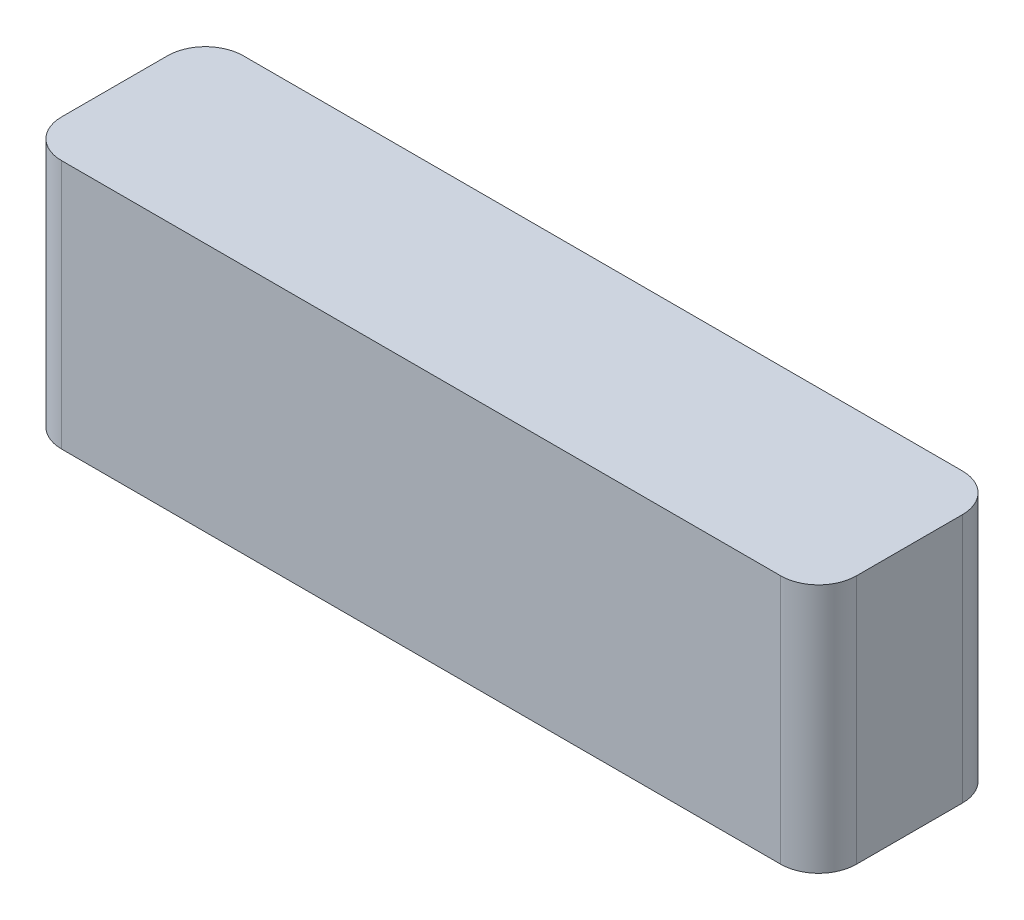
ISO-10303-21;
HEADER;
FILE_DESCRIPTION(('STEP AP214'),'2;1');
FILE_NAME('part.step','',(''),(''),'','','');
FILE_SCHEMA(('AUTOMOTIVE_DESIGN { 1 0 10303 214 1 1 1 1 }'));
ENDSEC;
DATA;
#1=APPLICATION_CONTEXT('core data for automotive mechanical design processes');
#2=APPLICATION_PROTOCOL_DEFINITION('international standard','automotive_design',2000,#1);
#3=PRODUCT_CONTEXT('',#1,'mechanical');
#4=PRODUCT('Part','Part','',(#3));
#5=PRODUCT_RELATED_PRODUCT_CATEGORY('part','',(#4));
#6=PRODUCT_DEFINITION_FORMATION('','',#4);
#7=PRODUCT_DEFINITION_CONTEXT('part definition',#1,'design');
#8=PRODUCT_DEFINITION('design','',#6,#7);
#9=PRODUCT_DEFINITION_SHAPE('','',#8);
#10=(LENGTH_UNIT() NAMED_UNIT(*) SI_UNIT(.MILLI.,.METRE.));
#11=(NAMED_UNIT(*) PLANE_ANGLE_UNIT() SI_UNIT($,.RADIAN.));
#12=(NAMED_UNIT(*) SI_UNIT($,.STERADIAN.) SOLID_ANGLE_UNIT());
#13=UNCERTAINTY_MEASURE_WITH_UNIT(LENGTH_MEASURE(1.E-05),#10,'distance_accuracy_value','');
#14=(GEOMETRIC_REPRESENTATION_CONTEXT(3) GLOBAL_UNCERTAINTY_ASSIGNED_CONTEXT((#13)) GLOBAL_UNIT_ASSIGNED_CONTEXT((#10,
#11,#12)) REPRESENTATION_CONTEXT('',''));
#15=CARTESIAN_POINT('',(0.,0.,0.));
#16=DIRECTION('',(0.,0.,1.));
#17=DIRECTION('',(1.,0.,0.));
#18=AXIS2_PLACEMENT_3D('',#15,#16,#17);
#19=CARTESIAN_POINT('',(52.5,33.,12.));
#20=DIRECTION('',(-1.,0.,0.));
#21=DIRECTION('',(0.,0.,1.));
#22=AXIS2_PLACEMENT_3D('',#19,#20,#21);
#23=PLANE('',#22);
#24=DIRECTION('',(0.,0.,-1.));
#25=VECTOR('',#24,1.);
#26=CARTESIAN_POINT('',(52.5,0.,12.));
#27=LINE('',#26,#25);
#28=CARTESIAN_POINT('',(52.5,0.,7.));
#29=VERTEX_POINT('',#28);
#30=CARTESIAN_POINT('',(52.5,0.,-7.));
#31=VERTEX_POINT('',#30);
#32=EDGE_CURVE('E156',#29,#31,#27,.T.);
#33=ORIENTED_EDGE('',*,*,#32,.T.);
#34=DIRECTION('',(0.,-1.,0.));
#35=VECTOR('',#34,1.);
#36=CARTESIAN_POINT('',(52.5,33.,-7.));
#37=LINE('',#36,#35);
#38=CARTESIAN_POINT('',(52.5,33.,-7.));
#39=VERTEX_POINT('',#38);
#40=EDGE_CURVE('E11',#31,#39,#37,.F.);
#41=ORIENTED_EDGE('',*,*,#40,.T.);
#42=DIRECTION('',(0.,0.,-1.));
#43=VECTOR('',#42,1.);
#44=CARTESIAN_POINT('',(52.5,33.,12.));
#45=LINE('',#44,#43);
#46=CARTESIAN_POINT('',(52.5,33.,7.));
#47=VERTEX_POINT('',#46);
#48=EDGE_CURVE('E124',#47,#39,#45,.T.);
#49=ORIENTED_EDGE('',*,*,#48,.F.);
#50=DIRECTION('',(0.,-1.,0.));
#51=VECTOR('',#50,1.);
#52=CARTESIAN_POINT('',(52.5,33.,7.));
#53=LINE('',#52,#51);
#54=EDGE_CURVE('E40',#47,#29,#53,.T.);
#55=ORIENTED_EDGE('',*,*,#54,.T.);
#56=EDGE_LOOP('',(#33,#41,#49,#55));
#57=FACE_BOUND('',#56,.T.);
#58=ADVANCED_FACE('F32',(#57),#23,.F.);
#59=CARTESIAN_POINT('',(-52.5,33.,-12.));
#60=DIRECTION('',(0.,0.,1.));
#61=DIRECTION('',(1.,0.,0.));
#62=AXIS2_PLACEMENT_3D('',#59,#60,#61);
#63=PLANE('',#62);
#64=DIRECTION('',(-1.,0.,0.));
#65=VECTOR('',#64,1.);
#66=CARTESIAN_POINT('',(-52.5,0.,-12.));
#67=LINE('',#66,#65);
#68=CARTESIAN_POINT('',(47.5,0.,-12.));
#69=VERTEX_POINT('',#68);
#70=CARTESIAN_POINT('',(-47.5,0.,-12.));
#71=VERTEX_POINT('',#70);
#72=EDGE_CURVE('E129',#69,#71,#67,.T.);
#73=ORIENTED_EDGE('',*,*,#72,.T.);
#74=DIRECTION('',(0.,-1.,0.));
#75=VECTOR('',#74,1.);
#76=CARTESIAN_POINT('',(-47.5,33.,-12.));
#77=LINE('',#76,#75);
#78=CARTESIAN_POINT('',(-47.5,33.,-12.));
#79=VERTEX_POINT('',#78);
#80=EDGE_CURVE('E47',#71,#79,#77,.F.);
#81=ORIENTED_EDGE('',*,*,#80,.T.);
#82=DIRECTION('',(-1.,0.,0.));
#83=VECTOR('',#82,1.);
#84=CARTESIAN_POINT('',(-52.5,33.,-12.));
#85=LINE('',#84,#83);
#86=CARTESIAN_POINT('',(47.5,33.,-12.));
#87=VERTEX_POINT('',#86);
#88=EDGE_CURVE('E127',#87,#79,#85,.T.);
#89=ORIENTED_EDGE('',*,*,#88,.F.);
#90=DIRECTION('',(0.,-1.,0.));
#91=VECTOR('',#90,1.);
#92=CARTESIAN_POINT('',(47.5,33.,-12.));
#93=LINE('',#92,#91);
#94=EDGE_CURVE('E148',#87,#69,#93,.T.);
#95=ORIENTED_EDGE('',*,*,#94,.T.);
#96=EDGE_LOOP('',(#73,#81,#89,#95));
#97=FACE_BOUND('',#96,.T.);
#98=ADVANCED_FACE('F176',(#97),#63,.F.);
#99=CARTESIAN_POINT('',(-52.5,33.,12.));
#100=DIRECTION('',(1.,0.,0.));
#101=DIRECTION('',(0.,0.,-1.));
#102=AXIS2_PLACEMENT_3D('',#99,#100,#101);
#103=PLANE('',#102);
#104=DIRECTION('',(0.,0.,1.));
#105=VECTOR('',#104,1.);
#106=CARTESIAN_POINT('',(-52.5,0.,12.));
#107=LINE('',#106,#105);
#108=CARTESIAN_POINT('',(-52.5,0.,-7.));
#109=VERTEX_POINT('',#108);
#110=CARTESIAN_POINT('',(-52.5,0.,7.));
#111=VERTEX_POINT('',#110);
#112=EDGE_CURVE('E125',#109,#111,#107,.T.);
#113=ORIENTED_EDGE('',*,*,#112,.T.);
#114=DIRECTION('',(0.,-1.,0.));
#115=VECTOR('',#114,1.);
#116=CARTESIAN_POINT('',(-52.5,33.,7.));
#117=LINE('',#116,#115);
#118=CARTESIAN_POINT('',(-52.5,33.,7.));
#119=VERTEX_POINT('',#118);
#120=EDGE_CURVE('E103',#111,#119,#117,.F.);
#121=ORIENTED_EDGE('',*,*,#120,.T.);
#122=DIRECTION('',(0.,0.,1.));
#123=VECTOR('',#122,1.);
#124=CARTESIAN_POINT('',(-52.5,33.,12.));
#125=LINE('',#124,#123);
#126=CARTESIAN_POINT('',(-52.5,33.,-7.));
#127=VERTEX_POINT('',#126);
#128=EDGE_CURVE('E164',#127,#119,#125,.T.);
#129=ORIENTED_EDGE('',*,*,#128,.F.);
#130=DIRECTION('',(0.,-1.,0.));
#131=VECTOR('',#130,1.);
#132=CARTESIAN_POINT('',(-52.5,33.,-7.));
#133=LINE('',#132,#131);
#134=EDGE_CURVE('E108',#127,#109,#133,.T.);
#135=ORIENTED_EDGE('',*,*,#134,.T.);
#136=EDGE_LOOP('',(#113,#121,#129,#135));
#137=FACE_BOUND('',#136,.T.);
#138=ADVANCED_FACE('F175',(#137),#103,.F.);
#139=CARTESIAN_POINT('',(-52.5,33.,12.));
#140=DIRECTION('',(0.,0.,-1.));
#141=DIRECTION('',(-1.,0.,0.));
#142=AXIS2_PLACEMENT_3D('',#139,#140,#141);
#143=PLANE('',#142);
#144=DIRECTION('',(1.,0.,0.));
#145=VECTOR('',#144,1.);
#146=CARTESIAN_POINT('',(-52.5,33.,12.));
#147=LINE('',#146,#145);
#148=CARTESIAN_POINT('',(-47.5,33.,12.));
#149=VERTEX_POINT('',#148);
#150=CARTESIAN_POINT('',(47.5,33.,12.));
#151=VERTEX_POINT('',#150);
#152=EDGE_CURVE('E118',#149,#151,#147,.T.);
#153=ORIENTED_EDGE('',*,*,#152,.F.);
#154=DIRECTION('',(0.,-1.,0.));
#155=VECTOR('',#154,1.);
#156=CARTESIAN_POINT('',(-47.5,33.,12.));
#157=LINE('',#156,#155);
#158=CARTESIAN_POINT('',(-47.5,0.,12.));
#159=VERTEX_POINT('',#158);
#160=EDGE_CURVE('E102',#149,#159,#157,.T.);
#161=ORIENTED_EDGE('',*,*,#160,.T.);
#162=DIRECTION('',(1.,0.,0.));
#163=VECTOR('',#162,1.);
#164=CARTESIAN_POINT('',(-52.5,0.,12.));
#165=LINE('',#164,#163);
#166=CARTESIAN_POINT('',(47.5,0.,12.));
#167=VERTEX_POINT('',#166);
#168=EDGE_CURVE('E115',#159,#167,#165,.T.);
#169=ORIENTED_EDGE('',*,*,#168,.T.);
#170=DIRECTION('',(0.,-1.,0.));
#171=VECTOR('',#170,1.);
#172=CARTESIAN_POINT('',(47.5,33.,12.));
#173=LINE('',#172,#171);
#174=EDGE_CURVE('E120',#167,#151,#173,.F.);
#175=ORIENTED_EDGE('',*,*,#174,.T.);
#176=EDGE_LOOP('',(#153,#161,#169,#175));
#177=FACE_BOUND('',#176,.T.);
#178=ADVANCED_FACE('F114',(#177),#143,.F.);
#179=CARTESIAN_POINT('',(0.,33.,0.));
#180=DIRECTION('',(0.,-1.,0.));
#181=DIRECTION('',(0.,0.,-1.));
#182=AXIS2_PLACEMENT_3D('',#179,#180,#181);
#183=PLANE('',#182);
#184=ORIENTED_EDGE('',*,*,#128,.T.);
#185=CARTESIAN_POINT('',(-47.5,33.,7.));
#186=DIRECTION('',(0.,-1.,0.));
#187=DIRECTION('',(0.,0.,-1.));
#188=AXIS2_PLACEMENT_3D('',#185,#186,#187);
#189=CIRCLE('',#188,5.);
#190=EDGE_CURVE('E146',#119,#149,#189,.F.);
#191=ORIENTED_EDGE('',*,*,#190,.T.);
#192=ORIENTED_EDGE('',*,*,#152,.T.);
#193=CARTESIAN_POINT('',(47.5,33.,7.));
#194=DIRECTION('',(0.,-1.,0.));
#195=DIRECTION('',(0.,0.,-1.));
#196=AXIS2_PLACEMENT_3D('',#193,#194,#195);
#197=CIRCLE('',#196,5.);
#198=EDGE_CURVE('E141',#151,#47,#197,.F.);
#199=ORIENTED_EDGE('',*,*,#198,.T.);
#200=ORIENTED_EDGE('',*,*,#48,.T.);
#201=CARTESIAN_POINT('',(47.5,33.,-7.));
#202=DIRECTION('',(0.,-1.,0.));
#203=DIRECTION('',(0.,0.,-1.));
#204=AXIS2_PLACEMENT_3D('',#201,#202,#203);
#205=CIRCLE('',#204,5.);
#206=EDGE_CURVE('E54',#39,#87,#205,.F.);
#207=ORIENTED_EDGE('',*,*,#206,.T.);
#208=ORIENTED_EDGE('',*,*,#88,.T.);
#209=CARTESIAN_POINT('',(-47.5,33.,-7.));
#210=DIRECTION('',(0.,-1.,0.));
#211=DIRECTION('',(0.,0.,-1.));
#212=AXIS2_PLACEMENT_3D('',#209,#210,#211);
#213=CIRCLE('',#212,5.);
#214=EDGE_CURVE('E144',#79,#127,#213,.F.);
#215=ORIENTED_EDGE('',*,*,#214,.T.);
#216=EDGE_LOOP('',(#184,#191,#192,#199,#200,#207,#208,#215));
#217=FACE_BOUND('',#216,.T.);
#218=ADVANCED_FACE('F168',(#217),#183,.F.);
#219=CARTESIAN_POINT('',(0.,0.,0.));
#220=DIRECTION('',(0.,-1.,0.));
#221=DIRECTION('',(0.,0.,-1.));
#222=AXIS2_PLACEMENT_3D('',#219,#220,#221);
#223=PLANE('',#222);
#224=ORIENTED_EDGE('',*,*,#168,.F.);
#225=CARTESIAN_POINT('',(-47.5,0.,7.));
#226=DIRECTION('',(0.,-1.,0.));
#227=DIRECTION('',(0.,0.,-1.));
#228=AXIS2_PLACEMENT_3D('',#225,#226,#227);
#229=CIRCLE('',#228,5.);
#230=EDGE_CURVE('E98',#159,#111,#229,.T.);
#231=ORIENTED_EDGE('',*,*,#230,.T.);
#232=ORIENTED_EDGE('',*,*,#112,.F.);
#233=CARTESIAN_POINT('',(-47.5,0.,-7.));
#234=DIRECTION('',(0.,-1.,0.));
#235=DIRECTION('',(0.,0.,-1.));
#236=AXIS2_PLACEMENT_3D('',#233,#234,#235);
#237=CIRCLE('',#236,5.);
#238=EDGE_CURVE('E109',#109,#71,#237,.T.);
#239=ORIENTED_EDGE('',*,*,#238,.T.);
#240=ORIENTED_EDGE('',*,*,#72,.F.);
#241=CARTESIAN_POINT('',(47.5,0.,-7.));
#242=DIRECTION('',(0.,-1.,0.));
#243=DIRECTION('',(0.,0.,-1.));
#244=AXIS2_PLACEMENT_3D('',#241,#242,#243);
#245=CIRCLE('',#244,5.);
#246=EDGE_CURVE('E135',#69,#31,#245,.T.);
#247=ORIENTED_EDGE('',*,*,#246,.T.);
#248=ORIENTED_EDGE('',*,*,#32,.F.);
#249=CARTESIAN_POINT('',(47.5,0.,7.));
#250=DIRECTION('',(0.,-1.,0.));
#251=DIRECTION('',(0.,0.,-1.));
#252=AXIS2_PLACEMENT_3D('',#249,#250,#251);
#253=CIRCLE('',#252,5.);
#254=EDGE_CURVE('E119',#29,#167,#253,.T.);
#255=ORIENTED_EDGE('',*,*,#254,.T.);
#256=EDGE_LOOP('',(#224,#231,#232,#239,#240,#247,#248,#255));
#257=FACE_BOUND('',#256,.T.);
#258=ADVANCED_FACE('F122',(#257),#223,.T.);
#259=CARTESIAN_POINT('',(-47.5,33.,7.));
#260=DIRECTION('',(0.,-1.,0.));
#261=DIRECTION('',(0.,0.,-1.));
#262=AXIS2_PLACEMENT_3D('',#259,#260,#261);
#263=CYLINDRICAL_SURFACE('',#262,5.);
#264=ORIENTED_EDGE('',*,*,#190,.F.);
#265=ORIENTED_EDGE('',*,*,#120,.F.);
#266=ORIENTED_EDGE('',*,*,#230,.F.);
#267=ORIENTED_EDGE('',*,*,#160,.F.);
#268=EDGE_LOOP('',(#264,#265,#266,#267));
#269=FACE_BOUND('',#268,.T.);
#270=ADVANCED_FACE('F101',(#269),#263,.T.);
#271=CARTESIAN_POINT('',(-47.5,33.,-7.));
#272=DIRECTION('',(0.,-1.,0.));
#273=DIRECTION('',(0.,0.,-1.));
#274=AXIS2_PLACEMENT_3D('',#271,#272,#273);
#275=CYLINDRICAL_SURFACE('',#274,5.);
#276=ORIENTED_EDGE('',*,*,#214,.F.);
#277=ORIENTED_EDGE('',*,*,#80,.F.);
#278=ORIENTED_EDGE('',*,*,#238,.F.);
#279=ORIENTED_EDGE('',*,*,#134,.F.);
#280=EDGE_LOOP('',(#276,#277,#278,#279));
#281=FACE_BOUND('',#280,.T.);
#282=ADVANCED_FACE('F173',(#281),#275,.T.);
#283=CARTESIAN_POINT('',(47.5,33.,-7.));
#284=DIRECTION('',(0.,-1.,0.));
#285=DIRECTION('',(0.,0.,-1.));
#286=AXIS2_PLACEMENT_3D('',#283,#284,#285);
#287=CYLINDRICAL_SURFACE('',#286,5.);
#288=ORIENTED_EDGE('',*,*,#206,.F.);
#289=ORIENTED_EDGE('',*,*,#40,.F.);
#290=ORIENTED_EDGE('',*,*,#246,.F.);
#291=ORIENTED_EDGE('',*,*,#94,.F.);
#292=EDGE_LOOP('',(#288,#289,#290,#291));
#293=FACE_BOUND('',#292,.T.);
#294=ADVANCED_FACE('F178',(#293),#287,.T.);
#295=CARTESIAN_POINT('',(47.5,33.,7.));
#296=DIRECTION('',(0.,-1.,0.));
#297=DIRECTION('',(0.,0.,-1.));
#298=AXIS2_PLACEMENT_3D('',#295,#296,#297);
#299=CYLINDRICAL_SURFACE('',#298,5.);
#300=ORIENTED_EDGE('',*,*,#198,.F.);
#301=ORIENTED_EDGE('',*,*,#174,.F.);
#302=ORIENTED_EDGE('',*,*,#254,.F.);
#303=ORIENTED_EDGE('',*,*,#54,.F.);
#304=EDGE_LOOP('',(#300,#301,#302,#303));
#305=FACE_BOUND('',#304,.T.);
#306=ADVANCED_FACE('F34',(#305),#299,.T.);
#307=CLOSED_SHELL('',(#58,#98,#138,#178,#218,#258,#270,#282,#294,#306));
#308=MANIFOLD_SOLID_BREP('B2',#307);
#309=ADVANCED_BREP_SHAPE_REPRESENTATION('',(#18,#308),#14);
#310=SHAPE_DEFINITION_REPRESENTATION(#9,#309);
ENDSEC;
END-ISO-10303-21;
